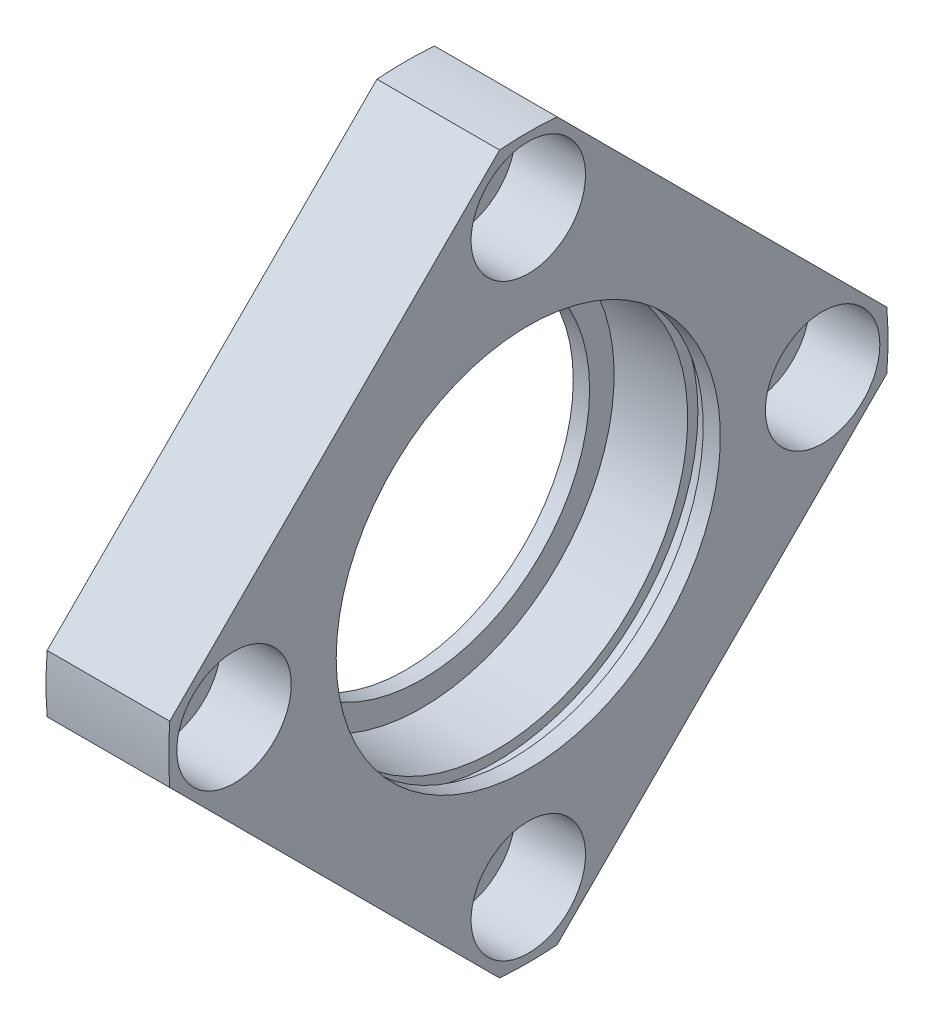
ISO-10303-21;
HEADER;
FILE_DESCRIPTION(('STEP AP214'),'2;1');
FILE_NAME('part.step','',(''),(''),'','','');
FILE_SCHEMA(('AUTOMOTIVE_DESIGN { 1 0 10303 214 1 1 1 1 }'));
ENDSEC;
DATA;
#1=APPLICATION_CONTEXT('core data for automotive mechanical design processes');
#2=APPLICATION_PROTOCOL_DEFINITION('international standard','automotive_design',2000,#1);
#3=PRODUCT_CONTEXT('',#1,'mechanical');
#4=PRODUCT('Part','Part','',(#3));
#5=PRODUCT_RELATED_PRODUCT_CATEGORY('part','',(#4));
#6=PRODUCT_DEFINITION_FORMATION('','',#4);
#7=PRODUCT_DEFINITION_CONTEXT('part definition',#1,'design');
#8=PRODUCT_DEFINITION('design','',#6,#7);
#9=PRODUCT_DEFINITION_SHAPE('','',#8);
#10=(LENGTH_UNIT() NAMED_UNIT(*) SI_UNIT(.MILLI.,.METRE.));
#11=(NAMED_UNIT(*) PLANE_ANGLE_UNIT() SI_UNIT($,.RADIAN.));
#12=(NAMED_UNIT(*) SI_UNIT($,.STERADIAN.) SOLID_ANGLE_UNIT());
#13=UNCERTAINTY_MEASURE_WITH_UNIT(LENGTH_MEASURE(1.E-05),#10,'distance_accuracy_value','');
#14=(GEOMETRIC_REPRESENTATION_CONTEXT(3) GLOBAL_UNCERTAINTY_ASSIGNED_CONTEXT((#13)) GLOBAL_UNIT_ASSIGNED_CONTEXT((#10,
#11,#12)) REPRESENTATION_CONTEXT('',''));
#15=CARTESIAN_POINT('',(0.,0.,0.));
#16=DIRECTION('',(0.,0.,1.));
#17=DIRECTION('',(1.,0.,0.));
#18=AXIS2_PLACEMENT_3D('',#15,#16,#17);
#19=CARTESIAN_POINT('',(15.,23.5,0.));
#20=DIRECTION('',(-1.,0.,0.));
#21=DIRECTION('',(0.,0.,1.));
#22=AXIS2_PLACEMENT_3D('',#19,#20,#21);
#23=PLANE('',#22);
#24=CARTESIAN_POINT('',(15.,36.,0.));
#25=DIRECTION('',(1.,0.,0.));
#26=DIRECTION('',(0.,0.,-1.));
#27=AXIS2_PLACEMENT_3D('',#24,#25,#26);
#28=CIRCLE('',#27,7.);
#29=CARTESIAN_POINT('',(15.,36.,-7.));
#30=VERTEX_POINT('',#29);
#31=EDGE_CURVE('E181',#30,#30,#28,.T.);
#32=ORIENTED_EDGE('',*,*,#31,.F.);
#33=EDGE_LOOP('',(#32));
#34=FACE_BOUND('',#33,.T.);
#35=CARTESIAN_POINT('',(15.,0.,-36.));
#36=DIRECTION('',(1.,0.,0.));
#37=DIRECTION('',(0.,0.,-1.));
#38=AXIS2_PLACEMENT_3D('',#35,#36,#37);
#39=CIRCLE('',#38,7.);
#40=CARTESIAN_POINT('',(15.,0.,-43.));
#41=VERTEX_POINT('',#40);
#42=EDGE_CURVE('E175',#41,#41,#39,.T.);
#43=ORIENTED_EDGE('',*,*,#42,.F.);
#44=EDGE_LOOP('',(#43));
#45=FACE_BOUND('',#44,.T.);
#46=CARTESIAN_POINT('',(15.,-36.,0.));
#47=DIRECTION('',(1.,0.,0.));
#48=DIRECTION('',(0.,0.,-1.));
#49=AXIS2_PLACEMENT_3D('',#46,#47,#48);
#50=CIRCLE('',#49,7.);
#51=CARTESIAN_POINT('',(15.,-36.,-7.));
#52=VERTEX_POINT('',#51);
#53=EDGE_CURVE('E169',#52,#52,#50,.T.);
#54=ORIENTED_EDGE('',*,*,#53,.F.);
#55=EDGE_LOOP('',(#54));
#56=FACE_BOUND('',#55,.T.);
#57=CARTESIAN_POINT('',(15.,0.,0.));
#58=DIRECTION('',(-1.,0.,0.));
#59=DIRECTION('',(0.,0.,1.));
#60=AXIS2_PLACEMENT_3D('',#57,#58,#59);
#61=CIRCLE('',#60,23.5);
#62=CARTESIAN_POINT('',(15.,0.,23.5));
#63=VERTEX_POINT('',#62);
#64=EDGE_CURVE('E157',#63,#63,#61,.T.);
#65=ORIENTED_EDGE('',*,*,#64,.T.);
#66=EDGE_LOOP('',(#65));
#67=FACE_BOUND('',#66,.T.);
#68=CARTESIAN_POINT('',(15.,0.,36.));
#69=DIRECTION('',(1.,0.,0.));
#70=DIRECTION('',(0.,0.,-1.));
#71=AXIS2_PLACEMENT_3D('',#68,#69,#70);
#72=CIRCLE('',#71,7.);
#73=CARTESIAN_POINT('',(15.,0.,29.));
#74=VERTEX_POINT('',#73);
#75=EDGE_CURVE('E163',#74,#74,#72,.T.);
#76=ORIENTED_EDGE('',*,*,#75,.F.);
#77=EDGE_LOOP('',(#76));
#78=FACE_BOUND('',#77,.T.);
#79=DIRECTION('',(0.,0.707106781186548,0.707106781186548));
#80=VECTOR('',#79,1.);
#81=CARTESIAN_POINT('',(15.,-3.51693441580504,43.8592199236936));
#82=LINE('',#81,#80);
#83=CARTESIAN_POINT('',(15.,-43.8592199236936,3.51693441580504));
#84=VERTEX_POINT('',#83);
#85=CARTESIAN_POINT('',(15.,-3.51693441580504,43.8592199236936));
#86=VERTEX_POINT('',#85);
#87=EDGE_CURVE('E101',#84,#86,#82,.T.);
#88=ORIENTED_EDGE('',*,*,#87,.F.);
#89=CARTESIAN_POINT('',(15.,0.,0.));
#90=DIRECTION('',(-1.,0.,0.));
#91=DIRECTION('',(0.,0.,1.));
#92=AXIS2_PLACEMENT_3D('',#89,#90,#91);
#93=CIRCLE('',#92,44.);
#94=CARTESIAN_POINT('',(15.,-43.8592199236936,-3.51693441580499));
#95=VERTEX_POINT('',#94);
#96=EDGE_CURVE('E113',#95,#84,#93,.T.);
#97=ORIENTED_EDGE('',*,*,#96,.F.);
#98=DIRECTION('',(0.,-0.707106781186547,0.707106781186547));
#99=VECTOR('',#98,1.);
#100=CARTESIAN_POINT('',(15.,-3.51693441580499,-43.8592199236936));
#101=LINE('',#100,#99);
#102=CARTESIAN_POINT('',(15.,-3.51693441580499,-43.8592199236936));
#103=VERTEX_POINT('',#102);
#104=EDGE_CURVE('E229',#103,#95,#101,.T.);
#105=ORIENTED_EDGE('',*,*,#104,.F.);
#106=CARTESIAN_POINT('',(15.,3.51693441580503,-43.8592199236936));
#107=VERTEX_POINT('',#106);
#108=EDGE_CURVE('E42',#107,#103,#93,.T.);
#109=ORIENTED_EDGE('',*,*,#108,.F.);
#110=DIRECTION('',(0.,-0.707106781186547,-0.707106781186548));
#111=VECTOR('',#110,1.);
#112=CARTESIAN_POINT('',(15.,43.8592199236936,-3.51693441580501));
#113=LINE('',#112,#111);
#114=CARTESIAN_POINT('',(15.,43.8592199236936,-3.51693441580501));
#115=VERTEX_POINT('',#114);
#116=EDGE_CURVE('E221',#115,#107,#113,.T.);
#117=ORIENTED_EDGE('',*,*,#116,.F.);
#118=CARTESIAN_POINT('',(15.,43.8592199236936,3.51693441580501));
#119=VERTEX_POINT('',#118);
#120=EDGE_CURVE('E11',#119,#115,#93,.T.);
#121=ORIENTED_EDGE('',*,*,#120,.F.);
#122=DIRECTION('',(0.,0.707106781186548,-0.707106781186548));
#123=VECTOR('',#122,1.);
#124=CARTESIAN_POINT('',(15.,43.8592199236936,3.51693441580501));
#125=LINE('',#124,#123);
#126=CARTESIAN_POINT('',(15.,3.51693441580502,43.8592199236936));
#127=VERTEX_POINT('',#126);
#128=EDGE_CURVE('E212',#127,#119,#125,.T.);
#129=ORIENTED_EDGE('',*,*,#128,.F.);
#130=EDGE_CURVE('E43',#86,#127,#93,.T.);
#131=ORIENTED_EDGE('',*,*,#130,.F.);
#132=EDGE_LOOP('',(#88,#97,#105,#109,#117,#121,#129,#131));
#133=FACE_BOUND('',#132,.T.);
#134=ADVANCED_FACE('F35',(#34,#45,#56,#67,#78,#133),#23,.F.);
#135=CARTESIAN_POINT('',(0.,0.,0.));
#136=DIRECTION('',(-1.,0.,0.));
#137=DIRECTION('',(0.,0.,1.));
#138=AXIS2_PLACEMENT_3D('',#135,#136,#137);
#139=CYLINDRICAL_SURFACE('',#138,44.);
#140=DIRECTION('',(-1.,0.,0.));
#141=VECTOR('',#140,1.);
#142=CARTESIAN_POINT('',(15.,-3.51693441580504,43.8592199236936));
#143=LINE('',#142,#141);
#144=CARTESIAN_POINT('',(0.,-3.51693441580504,43.8592199236937));
#145=VERTEX_POINT('',#144);
#146=EDGE_CURVE('E50',#86,#145,#143,.T.);
#147=ORIENTED_EDGE('',*,*,#146,.F.);
#148=ORIENTED_EDGE('',*,*,#130,.T.);
#149=DIRECTION('',(-1.,0.,0.));
#150=VECTOR('',#149,1.);
#151=CARTESIAN_POINT('',(15.,3.51693441580502,43.8592199236936));
#152=LINE('',#151,#150);
#153=CARTESIAN_POINT('',(0.,3.51693441580502,43.8592199236936));
#154=VERTEX_POINT('',#153);
#155=EDGE_CURVE('E208',#127,#154,#152,.T.);
#156=ORIENTED_EDGE('',*,*,#155,.T.);
#157=CARTESIAN_POINT('',(0.,0.,0.));
#158=DIRECTION('',(-1.,0.,0.));
#159=DIRECTION('',(0.,0.,1.));
#160=AXIS2_PLACEMENT_3D('',#157,#158,#159);
#161=CIRCLE('',#160,44.);
#162=EDGE_CURVE('E124',#145,#154,#161,.T.);
#163=ORIENTED_EDGE('',*,*,#162,.F.);
#164=EDGE_LOOP('',(#147,#148,#156,#163));
#165=FACE_BOUND('',#164,.T.);
#166=ADVANCED_FACE('F234',(#165),#139,.T.);
#167=DIRECTION('',(-1.,0.,0.));
#168=VECTOR('',#167,1.);
#169=CARTESIAN_POINT('',(15.,-43.8592199236936,3.51693441580504));
#170=LINE('',#169,#168);
#171=CARTESIAN_POINT('',(0.,-43.8592199236936,3.51693441580504));
#172=VERTEX_POINT('',#171);
#173=EDGE_CURVE('E98',#84,#172,#170,.T.);
#174=ORIENTED_EDGE('',*,*,#173,.T.);
#175=CARTESIAN_POINT('',(0.,-43.8592199236937,-3.51693441580499));
#176=VERTEX_POINT('',#175);
#177=EDGE_CURVE('E130',#176,#172,#161,.T.);
#178=ORIENTED_EDGE('',*,*,#177,.F.);
#179=DIRECTION('',(-1.,0.,0.));
#180=VECTOR('',#179,1.);
#181=CARTESIAN_POINT('',(15.,-43.8592199236936,-3.51693441580499));
#182=LINE('',#181,#180);
#183=EDGE_CURVE('E58',#95,#176,#182,.T.);
#184=ORIENTED_EDGE('',*,*,#183,.F.);
#185=ORIENTED_EDGE('',*,*,#96,.T.);
#186=EDGE_LOOP('',(#174,#178,#184,#185));
#187=FACE_BOUND('',#186,.T.);
#188=ADVANCED_FACE('F116',(#187),#139,.T.);
#189=CARTESIAN_POINT('',(0.,44.,0.));
#190=DIRECTION('',(1.,0.,0.));
#191=DIRECTION('',(0.,0.,-1.));
#192=AXIS2_PLACEMENT_3D('',#189,#190,#191);
#193=PLANE('',#192);
#194=CARTESIAN_POINT('',(0.,36.,0.));
#195=DIRECTION('',(1.,0.,0.));
#196=DIRECTION('',(0.,0.,-1.));
#197=AXIS2_PLACEMENT_3D('',#194,#195,#196);
#198=CIRCLE('',#197,4.25);
#199=CARTESIAN_POINT('',(0.,36.,-4.24999999999999));
#200=VERTEX_POINT('',#199);
#201=EDGE_CURVE('E202',#200,#200,#198,.T.);
#202=ORIENTED_EDGE('',*,*,#201,.T.);
#203=EDGE_LOOP('',(#202));
#204=FACE_BOUND('',#203,.T.);
#205=CARTESIAN_POINT('',(0.,0.,-36.));
#206=DIRECTION('',(1.,0.,0.));
#207=DIRECTION('',(0.,0.,-1.));
#208=AXIS2_PLACEMENT_3D('',#205,#206,#207);
#209=CIRCLE('',#208,4.25);
#210=CARTESIAN_POINT('',(0.,0.,-40.25));
#211=VERTEX_POINT('',#210);
#212=EDGE_CURVE('E196',#211,#211,#209,.T.);
#213=ORIENTED_EDGE('',*,*,#212,.T.);
#214=EDGE_LOOP('',(#213));
#215=FACE_BOUND('',#214,.T.);
#216=CARTESIAN_POINT('',(0.,-36.,0.));
#217=DIRECTION('',(1.,0.,0.));
#218=DIRECTION('',(0.,0.,-1.));
#219=AXIS2_PLACEMENT_3D('',#216,#217,#218);
#220=CIRCLE('',#219,4.25);
#221=CARTESIAN_POINT('',(0.,-36.,-4.25));
#222=VERTEX_POINT('',#221);
#223=EDGE_CURVE('E190',#222,#222,#220,.T.);
#224=ORIENTED_EDGE('',*,*,#223,.T.);
#225=EDGE_LOOP('',(#224));
#226=FACE_BOUND('',#225,.T.);
#227=CARTESIAN_POINT('',(0.,0.,36.));
#228=DIRECTION('',(1.,0.,0.));
#229=DIRECTION('',(0.,0.,-1.));
#230=AXIS2_PLACEMENT_3D('',#227,#228,#229);
#231=CIRCLE('',#230,4.25);
#232=CARTESIAN_POINT('',(0.,0.,31.75));
#233=VERTEX_POINT('',#232);
#234=EDGE_CURVE('E184',#233,#233,#231,.T.);
#235=ORIENTED_EDGE('',*,*,#234,.T.);
#236=EDGE_LOOP('',(#235));
#237=FACE_BOUND('',#236,.T.);
#238=CARTESIAN_POINT('',(0.,0.,0.));
#239=DIRECTION('',(-1.,0.,0.));
#240=DIRECTION('',(0.,0.,1.));
#241=AXIS2_PLACEMENT_3D('',#238,#239,#240);
#242=CIRCLE('',#241,20.5);
#243=CARTESIAN_POINT('',(0.,0.,20.5));
#244=VERTEX_POINT('',#243);
#245=EDGE_CURVE('E132',#244,#244,#242,.T.);
#246=ORIENTED_EDGE('',*,*,#245,.F.);
#247=EDGE_LOOP('',(#246));
#248=FACE_BOUND('',#247,.T.);
#249=DIRECTION('',(0.,0.707106781186548,0.707106781186548));
#250=VECTOR('',#249,1.);
#251=CARTESIAN_POINT('',(0.,-3.51693441580504,43.8592199236936));
#252=LINE('',#251,#250);
#253=EDGE_CURVE('E102',#172,#145,#252,.T.);
#254=ORIENTED_EDGE('',*,*,#253,.T.);
#255=ORIENTED_EDGE('',*,*,#162,.T.);
#256=DIRECTION('',(0.,0.707106781186548,-0.707106781186548));
#257=VECTOR('',#256,1.);
#258=CARTESIAN_POINT('',(0.,43.8592199236936,3.51693441580501));
#259=LINE('',#258,#257);
#260=CARTESIAN_POINT('',(0.,43.8592199236937,3.51693441580501));
#261=VERTEX_POINT('',#260);
#262=EDGE_CURVE('E213',#154,#261,#259,.T.);
#263=ORIENTED_EDGE('',*,*,#262,.T.);
#264=CARTESIAN_POINT('',(0.,43.8592199236936,-3.51693441580501));
#265=VERTEX_POINT('',#264);
#266=EDGE_CURVE('E118',#261,#265,#161,.T.);
#267=ORIENTED_EDGE('',*,*,#266,.T.);
#268=DIRECTION('',(0.,-0.707106781186547,-0.707106781186548));
#269=VECTOR('',#268,1.);
#270=CARTESIAN_POINT('',(0.,43.8592199236936,-3.51693441580501));
#271=LINE('',#270,#269);
#272=CARTESIAN_POINT('',(0.,3.51693441580501,-43.8592199236937));
#273=VERTEX_POINT('',#272);
#274=EDGE_CURVE('E222',#265,#273,#271,.T.);
#275=ORIENTED_EDGE('',*,*,#274,.T.);
#276=CARTESIAN_POINT('',(0.,-3.51693441580499,-43.8592199236936));
#277=VERTEX_POINT('',#276);
#278=EDGE_CURVE('E123',#273,#277,#161,.T.);
#279=ORIENTED_EDGE('',*,*,#278,.T.);
#280=DIRECTION('',(0.,-0.707106781186547,0.707106781186547));
#281=VECTOR('',#280,1.);
#282=CARTESIAN_POINT('',(0.,-3.51693441580499,-43.8592199236936));
#283=LINE('',#282,#281);
#284=EDGE_CURVE('E107',#277,#176,#283,.T.);
#285=ORIENTED_EDGE('',*,*,#284,.T.);
#286=ORIENTED_EDGE('',*,*,#177,.T.);
#287=EDGE_LOOP('',(#254,#255,#263,#267,#275,#279,#285,#286));
#288=FACE_BOUND('',#287,.T.);
#289=ADVANCED_FACE('F233',(#204,#215,#226,#237,#248,#288),#193,.F.);
#290=DIRECTION('',(-1.,0.,0.));
#291=VECTOR('',#290,1.);
#292=CARTESIAN_POINT('',(15.,-3.51693441580499,-43.8592199236936));
#293=LINE('',#292,#291);
#294=EDGE_CURVE('E224',#103,#277,#293,.T.);
#295=ORIENTED_EDGE('',*,*,#294,.T.);
#296=ORIENTED_EDGE('',*,*,#278,.F.);
#297=DIRECTION('',(-1.,0.,0.));
#298=VECTOR('',#297,1.);
#299=CARTESIAN_POINT('',(15.,3.51693441580503,-43.8592199236936));
#300=LINE('',#299,#298);
#301=EDGE_CURVE('E219',#107,#273,#300,.T.);
#302=ORIENTED_EDGE('',*,*,#301,.F.);
#303=ORIENTED_EDGE('',*,*,#108,.T.);
#304=EDGE_LOOP('',(#295,#296,#302,#303));
#305=FACE_BOUND('',#304,.T.);
#306=ADVANCED_FACE('F248',(#305),#139,.T.);
#307=DIRECTION('',(-1.,0.,0.));
#308=VECTOR('',#307,1.);
#309=CARTESIAN_POINT('',(15.,43.8592199236936,-3.51693441580501));
#310=LINE('',#309,#308);
#311=EDGE_CURVE('E215',#115,#265,#310,.T.);
#312=ORIENTED_EDGE('',*,*,#311,.T.);
#313=ORIENTED_EDGE('',*,*,#266,.F.);
#314=DIRECTION('',(-1.,0.,0.));
#315=VECTOR('',#314,1.);
#316=CARTESIAN_POINT('',(15.,43.8592199236936,3.51693441580501));
#317=LINE('',#316,#315);
#318=EDGE_CURVE('E210',#119,#261,#317,.T.);
#319=ORIENTED_EDGE('',*,*,#318,.F.);
#320=ORIENTED_EDGE('',*,*,#120,.T.);
#321=EDGE_LOOP('',(#312,#313,#319,#320));
#322=FACE_BOUND('',#321,.T.);
#323=ADVANCED_FACE('F242',(#322),#139,.T.);
#324=CARTESIAN_POINT('',(0.,0.,0.));
#325=DIRECTION('',(-1.,0.,0.));
#326=DIRECTION('',(0.,0.,1.));
#327=AXIS2_PLACEMENT_3D('',#324,#325,#326);
#328=CYLINDRICAL_SURFACE('',#327,20.5);
#329=CARTESIAN_POINT('',(2.,0.,0.));
#330=DIRECTION('',(-1.,0.,0.));
#331=DIRECTION('',(0.,0.,1.));
#332=AXIS2_PLACEMENT_3D('',#329,#330,#331);
#333=CIRCLE('',#332,20.5);
#334=CARTESIAN_POINT('',(2.,0.,20.5));
#335=VERTEX_POINT('',#334);
#336=EDGE_CURVE('E136',#335,#335,#333,.T.);
#337=ORIENTED_EDGE('',*,*,#336,.F.);
#338=EDGE_LOOP('',(#337));
#339=FACE_BOUND('',#338,.T.);
#340=ORIENTED_EDGE('',*,*,#245,.T.);
#341=EDGE_LOOP('',(#340));
#342=FACE_BOUND('',#341,.T.);
#343=ADVANCED_FACE('F314',(#339,#342),#328,.F.);
#344=CARTESIAN_POINT('',(2.,20.5,0.));
#345=DIRECTION('',(-1.,0.,0.));
#346=DIRECTION('',(0.,0.,1.));
#347=AXIS2_PLACEMENT_3D('',#344,#345,#346);
#348=PLANE('',#347);
#349=CARTESIAN_POINT('',(2.,0.,0.));
#350=DIRECTION('',(-1.,0.,0.));
#351=DIRECTION('',(0.,0.,1.));
#352=AXIS2_PLACEMENT_3D('',#349,#350,#351);
#353=CIRCLE('',#352,23.5);
#354=CARTESIAN_POINT('',(2.,0.,23.5));
#355=VERTEX_POINT('',#354);
#356=EDGE_CURVE('E140',#355,#355,#353,.T.);
#357=ORIENTED_EDGE('',*,*,#356,.F.);
#358=EDGE_LOOP('',(#357));
#359=FACE_BOUND('',#358,.T.);
#360=ORIENTED_EDGE('',*,*,#336,.T.);
#361=EDGE_LOOP('',(#360));
#362=FACE_BOUND('',#361,.T.);
#363=ADVANCED_FACE('F310',(#359,#362),#348,.F.);
#364=CARTESIAN_POINT('',(0.,0.,0.));
#365=DIRECTION('',(-1.,0.,0.));
#366=DIRECTION('',(0.,0.,1.));
#367=AXIS2_PLACEMENT_3D('',#364,#365,#366);
#368=CYLINDRICAL_SURFACE('',#367,23.5);
#369=CARTESIAN_POINT('',(11.,0.,0.));
#370=DIRECTION('',(-1.,0.,0.));
#371=DIRECTION('',(0.,0.,1.));
#372=AXIS2_PLACEMENT_3D('',#369,#370,#371);
#373=CIRCLE('',#372,23.5);
#374=CARTESIAN_POINT('',(11.,0.,23.5));
#375=VERTEX_POINT('',#374);
#376=EDGE_CURVE('E145',#375,#375,#373,.T.);
#377=ORIENTED_EDGE('',*,*,#376,.F.);
#378=EDGE_LOOP('',(#377));
#379=FACE_BOUND('',#378,.T.);
#380=ORIENTED_EDGE('',*,*,#356,.T.);
#381=EDGE_LOOP('',(#380));
#382=FACE_BOUND('',#381,.T.);
#383=ADVANCED_FACE('F306',(#379,#382),#368,.F.);
#384=CARTESIAN_POINT('',(11.,23.5,0.));
#385=DIRECTION('',(-1.,0.,0.));
#386=DIRECTION('',(0.,0.,1.));
#387=AXIS2_PLACEMENT_3D('',#384,#385,#386);
#388=PLANE('',#387);
#389=CARTESIAN_POINT('',(11.,0.,0.));
#390=DIRECTION('',(-1.,0.,0.));
#391=DIRECTION('',(0.,0.,1.));
#392=AXIS2_PLACEMENT_3D('',#389,#390,#391);
#393=CIRCLE('',#392,24.75);
#394=CARTESIAN_POINT('',(11.,0.,24.75));
#395=VERTEX_POINT('',#394);
#396=EDGE_CURVE('E148',#395,#395,#393,.T.);
#397=ORIENTED_EDGE('',*,*,#396,.F.);
#398=EDGE_LOOP('',(#397));
#399=FACE_BOUND('',#398,.T.);
#400=ORIENTED_EDGE('',*,*,#376,.T.);
#401=EDGE_LOOP('',(#400));
#402=FACE_BOUND('',#401,.T.);
#403=ADVANCED_FACE('F302',(#399,#402),#388,.F.);
#404=CARTESIAN_POINT('',(0.,0.,0.));
#405=DIRECTION('',(-1.,0.,0.));
#406=DIRECTION('',(0.,0.,1.));
#407=AXIS2_PLACEMENT_3D('',#404,#405,#406);
#408=CYLINDRICAL_SURFACE('',#407,24.75);
#409=CARTESIAN_POINT('',(12.9,0.,0.));
#410=DIRECTION('',(-1.,0.,0.));
#411=DIRECTION('',(0.,0.,1.));
#412=AXIS2_PLACEMENT_3D('',#409,#410,#411);
#413=CIRCLE('',#412,24.75);
#414=CARTESIAN_POINT('',(12.9,0.,24.75));
#415=VERTEX_POINT('',#414);
#416=EDGE_CURVE('E151',#415,#415,#413,.T.);
#417=ORIENTED_EDGE('',*,*,#416,.F.);
#418=EDGE_LOOP('',(#417));
#419=FACE_BOUND('',#418,.T.);
#420=ORIENTED_EDGE('',*,*,#396,.T.);
#421=EDGE_LOOP('',(#420));
#422=FACE_BOUND('',#421,.T.);
#423=ADVANCED_FACE('F298',(#419,#422),#408,.F.);
#424=CARTESIAN_POINT('',(12.9,24.75,0.));
#425=DIRECTION('',(1.,0.,0.));
#426=DIRECTION('',(0.,0.,-1.));
#427=AXIS2_PLACEMENT_3D('',#424,#425,#426);
#428=PLANE('',#427);
#429=CARTESIAN_POINT('',(12.9,0.,0.));
#430=DIRECTION('',(-1.,0.,0.));
#431=DIRECTION('',(0.,0.,1.));
#432=AXIS2_PLACEMENT_3D('',#429,#430,#431);
#433=CIRCLE('',#432,23.5);
#434=CARTESIAN_POINT('',(12.9,0.,23.5));
#435=VERTEX_POINT('',#434);
#436=EDGE_CURVE('E154',#435,#435,#433,.T.);
#437=ORIENTED_EDGE('',*,*,#436,.F.);
#438=EDGE_LOOP('',(#437));
#439=FACE_BOUND('',#438,.T.);
#440=ORIENTED_EDGE('',*,*,#416,.T.);
#441=EDGE_LOOP('',(#440));
#442=FACE_BOUND('',#441,.T.);
#443=ADVANCED_FACE('F294',(#439,#442),#428,.F.);
#444=CARTESIAN_POINT('',(0.,0.,0.));
#445=DIRECTION('',(-1.,0.,0.));
#446=DIRECTION('',(0.,0.,1.));
#447=AXIS2_PLACEMENT_3D('',#444,#445,#446);
#448=CYLINDRICAL_SURFACE('',#447,23.5);
#449=ORIENTED_EDGE('',*,*,#64,.F.);
#450=EDGE_LOOP('',(#449));
#451=FACE_BOUND('',#450,.T.);
#452=ORIENTED_EDGE('',*,*,#436,.T.);
#453=EDGE_LOOP('',(#452));
#454=FACE_BOUND('',#453,.T.);
#455=ADVANCED_FACE('F286',(#451,#454),#448,.F.);
#456=CARTESIAN_POINT('',(6.4,0.,36.));
#457=DIRECTION('',(-1.,0.,0.));
#458=DIRECTION('',(0.,0.,1.));
#459=AXIS2_PLACEMENT_3D('',#456,#457,#458);
#460=PLANE('',#459);
#461=CARTESIAN_POINT('',(6.4,0.,36.));
#462=DIRECTION('',(1.,0.,0.));
#463=DIRECTION('',(0.,0.,-1.));
#464=AXIS2_PLACEMENT_3D('',#461,#462,#463);
#465=CIRCLE('',#464,4.25);
#466=CARTESIAN_POINT('',(6.4,0.,31.75));
#467=VERTEX_POINT('',#466);
#468=EDGE_CURVE('E187',#467,#467,#465,.T.);
#469=ORIENTED_EDGE('',*,*,#468,.F.);
#470=EDGE_LOOP('',(#469));
#471=FACE_BOUND('',#470,.T.);
#472=CARTESIAN_POINT('',(6.4,0.,36.));
#473=DIRECTION('',(1.,0.,0.));
#474=DIRECTION('',(0.,0.,-1.));
#475=AXIS2_PLACEMENT_3D('',#472,#473,#474);
#476=CIRCLE('',#475,7.);
#477=CARTESIAN_POINT('',(6.4,0.,29.));
#478=VERTEX_POINT('',#477);
#479=EDGE_CURVE('E160',#478,#478,#476,.T.);
#480=ORIENTED_EDGE('',*,*,#479,.T.);
#481=EDGE_LOOP('',(#480));
#482=FACE_BOUND('',#481,.T.);
#483=ADVANCED_FACE('F276',(#471,#482),#460,.F.);
#484=CARTESIAN_POINT('',(15.,0.,36.));
#485=DIRECTION('',(1.,0.,0.));
#486=DIRECTION('',(0.,0.,-1.));
#487=AXIS2_PLACEMENT_3D('',#484,#485,#486);
#488=CYLINDRICAL_SURFACE('',#487,7.);
#489=ORIENTED_EDGE('',*,*,#479,.F.);
#490=EDGE_LOOP('',(#489));
#491=FACE_BOUND('',#490,.T.);
#492=ORIENTED_EDGE('',*,*,#75,.T.);
#493=EDGE_LOOP('',(#492));
#494=FACE_BOUND('',#493,.T.);
#495=ADVANCED_FACE('F273',(#491,#494),#488,.F.);
#496=CARTESIAN_POINT('',(6.40000000000001,-36.,0.));
#497=DIRECTION('',(-1.,0.,0.));
#498=DIRECTION('',(0.,0.,1.));
#499=AXIS2_PLACEMENT_3D('',#496,#497,#498);
#500=PLANE('',#499);
#501=CARTESIAN_POINT('',(6.4,-36.,0.));
#502=DIRECTION('',(1.,0.,0.));
#503=DIRECTION('',(0.,0.,-1.));
#504=AXIS2_PLACEMENT_3D('',#501,#502,#503);
#505=CIRCLE('',#504,4.25);
#506=CARTESIAN_POINT('',(6.4,-36.,-4.25));
#507=VERTEX_POINT('',#506);
#508=EDGE_CURVE('E193',#507,#507,#505,.T.);
#509=ORIENTED_EDGE('',*,*,#508,.F.);
#510=EDGE_LOOP('',(#509));
#511=FACE_BOUND('',#510,.T.);
#512=CARTESIAN_POINT('',(6.40000000000001,-36.,0.));
#513=DIRECTION('',(1.,0.,0.));
#514=DIRECTION('',(0.,0.,-1.));
#515=AXIS2_PLACEMENT_3D('',#512,#513,#514);
#516=CIRCLE('',#515,7.);
#517=CARTESIAN_POINT('',(6.40000000000001,-36.,-7.));
#518=VERTEX_POINT('',#517);
#519=EDGE_CURVE('E166',#518,#518,#516,.T.);
#520=ORIENTED_EDGE('',*,*,#519,.T.);
#521=EDGE_LOOP('',(#520));
#522=FACE_BOUND('',#521,.T.);
#523=ADVANCED_FACE('F275',(#511,#522),#500,.F.);
#524=CARTESIAN_POINT('',(15.,-36.,0.));
#525=DIRECTION('',(1.,0.,0.));
#526=DIRECTION('',(0.,0.,-1.));
#527=AXIS2_PLACEMENT_3D('',#524,#525,#526);
#528=CYLINDRICAL_SURFACE('',#527,7.);
#529=ORIENTED_EDGE('',*,*,#519,.F.);
#530=EDGE_LOOP('',(#529));
#531=FACE_BOUND('',#530,.T.);
#532=ORIENTED_EDGE('',*,*,#53,.T.);
#533=EDGE_LOOP('',(#532));
#534=FACE_BOUND('',#533,.T.);
#535=ADVANCED_FACE('F283',(#531,#534),#528,.F.);
#536=CARTESIAN_POINT('',(6.4,0.,-36.));
#537=DIRECTION('',(-1.,0.,0.));
#538=DIRECTION('',(0.,0.,1.));
#539=AXIS2_PLACEMENT_3D('',#536,#537,#538);
#540=PLANE('',#539);
#541=CARTESIAN_POINT('',(6.4,0.,-36.));
#542=DIRECTION('',(1.,0.,0.));
#543=DIRECTION('',(0.,0.,-1.));
#544=AXIS2_PLACEMENT_3D('',#541,#542,#543);
#545=CIRCLE('',#544,4.25);
#546=CARTESIAN_POINT('',(6.4,0.,-40.25));
#547=VERTEX_POINT('',#546);
#548=EDGE_CURVE('E199',#547,#547,#545,.T.);
#549=ORIENTED_EDGE('',*,*,#548,.F.);
#550=EDGE_LOOP('',(#549));
#551=FACE_BOUND('',#550,.T.);
#552=CARTESIAN_POINT('',(6.4,0.,-36.));
#553=DIRECTION('',(1.,0.,0.));
#554=DIRECTION('',(0.,0.,-1.));
#555=AXIS2_PLACEMENT_3D('',#552,#553,#554);
#556=CIRCLE('',#555,7.);
#557=CARTESIAN_POINT('',(6.4,0.,-43.));
#558=VERTEX_POINT('',#557);
#559=EDGE_CURVE('E172',#558,#558,#556,.T.);
#560=ORIENTED_EDGE('',*,*,#559,.T.);
#561=EDGE_LOOP('',(#560));
#562=FACE_BOUND('',#561,.T.);
#563=ADVANCED_FACE('F360',(#551,#562),#540,.F.);
#564=CARTESIAN_POINT('',(15.,0.,-36.));
#565=DIRECTION('',(1.,0.,0.));
#566=DIRECTION('',(0.,0.,-1.));
#567=AXIS2_PLACEMENT_3D('',#564,#565,#566);
#568=CYLINDRICAL_SURFACE('',#567,7.);
#569=ORIENTED_EDGE('',*,*,#559,.F.);
#570=EDGE_LOOP('',(#569));
#571=FACE_BOUND('',#570,.T.);
#572=ORIENTED_EDGE('',*,*,#42,.T.);
#573=EDGE_LOOP('',(#572));
#574=FACE_BOUND('',#573,.T.);
#575=ADVANCED_FACE('F356',(#571,#574),#568,.F.);
#576=CARTESIAN_POINT('',(6.4,36.,0.));
#577=DIRECTION('',(-1.,0.,0.));
#578=DIRECTION('',(0.,0.,1.));
#579=AXIS2_PLACEMENT_3D('',#576,#577,#578);
#580=PLANE('',#579);
#581=CARTESIAN_POINT('',(6.4,36.,0.));
#582=DIRECTION('',(1.,0.,0.));
#583=DIRECTION('',(0.,0.,-1.));
#584=AXIS2_PLACEMENT_3D('',#581,#582,#583);
#585=CIRCLE('',#584,4.25);
#586=CARTESIAN_POINT('',(6.4,36.,-4.24999999999999));
#587=VERTEX_POINT('',#586);
#588=EDGE_CURVE('E205',#587,#587,#585,.T.);
#589=ORIENTED_EDGE('',*,*,#588,.F.);
#590=EDGE_LOOP('',(#589));
#591=FACE_BOUND('',#590,.T.);
#592=CARTESIAN_POINT('',(6.4,36.,0.));
#593=DIRECTION('',(1.,0.,0.));
#594=DIRECTION('',(0.,0.,-1.));
#595=AXIS2_PLACEMENT_3D('',#592,#593,#594);
#596=CIRCLE('',#595,7.);
#597=CARTESIAN_POINT('',(6.4,36.,-6.99999999999999));
#598=VERTEX_POINT('',#597);
#599=EDGE_CURVE('E178',#598,#598,#596,.T.);
#600=ORIENTED_EDGE('',*,*,#599,.T.);
#601=EDGE_LOOP('',(#600));
#602=FACE_BOUND('',#601,.T.);
#603=ADVANCED_FACE('F349',(#591,#602),#580,.F.);
#604=CARTESIAN_POINT('',(15.,36.,0.));
#605=DIRECTION('',(1.,0.,0.));
#606=DIRECTION('',(0.,0.,-1.));
#607=AXIS2_PLACEMENT_3D('',#604,#605,#606);
#608=CYLINDRICAL_SURFACE('',#607,7.);
#609=ORIENTED_EDGE('',*,*,#599,.F.);
#610=EDGE_LOOP('',(#609));
#611=FACE_BOUND('',#610,.T.);
#612=ORIENTED_EDGE('',*,*,#31,.T.);
#613=EDGE_LOOP('',(#612));
#614=FACE_BOUND('',#613,.T.);
#615=ADVANCED_FACE('F338',(#611,#614),#608,.F.);
#616=CARTESIAN_POINT('',(6.4,0.,36.));
#617=DIRECTION('',(1.,0.,0.));
#618=DIRECTION('',(0.,0.,-1.));
#619=AXIS2_PLACEMENT_3D('',#616,#617,#618);
#620=CYLINDRICAL_SURFACE('',#619,4.25);
#621=ORIENTED_EDGE('',*,*,#234,.F.);
#622=EDGE_LOOP('',(#621));
#623=FACE_BOUND('',#622,.T.);
#624=ORIENTED_EDGE('',*,*,#468,.T.);
#625=EDGE_LOOP('',(#624));
#626=FACE_BOUND('',#625,.T.);
#627=ADVANCED_FACE('F334',(#623,#626),#620,.F.);
#628=CARTESIAN_POINT('',(6.4,-36.,0.));
#629=DIRECTION('',(1.,0.,0.));
#630=DIRECTION('',(0.,0.,-1.));
#631=AXIS2_PLACEMENT_3D('',#628,#629,#630);
#632=CYLINDRICAL_SURFACE('',#631,4.25);
#633=ORIENTED_EDGE('',*,*,#223,.F.);
#634=EDGE_LOOP('',(#633));
#635=FACE_BOUND('',#634,.T.);
#636=ORIENTED_EDGE('',*,*,#508,.T.);
#637=EDGE_LOOP('',(#636));
#638=FACE_BOUND('',#637,.T.);
#639=ADVANCED_FACE('F337',(#635,#638),#632,.F.);
#640=CARTESIAN_POINT('',(6.4,0.,-36.));
#641=DIRECTION('',(1.,0.,0.));
#642=DIRECTION('',(0.,0.,-1.));
#643=AXIS2_PLACEMENT_3D('',#640,#641,#642);
#644=CYLINDRICAL_SURFACE('',#643,4.25);
#645=ORIENTED_EDGE('',*,*,#212,.F.);
#646=EDGE_LOOP('',(#645));
#647=FACE_BOUND('',#646,.T.);
#648=ORIENTED_EDGE('',*,*,#548,.T.);
#649=EDGE_LOOP('',(#648));
#650=FACE_BOUND('',#649,.T.);
#651=ADVANCED_FACE('F346',(#647,#650),#644,.F.);
#652=CARTESIAN_POINT('',(6.4,36.,0.));
#653=DIRECTION('',(1.,0.,0.));
#654=DIRECTION('',(0.,0.,-1.));
#655=AXIS2_PLACEMENT_3D('',#652,#653,#654);
#656=CYLINDRICAL_SURFACE('',#655,4.25);
#657=ORIENTED_EDGE('',*,*,#201,.F.);
#658=EDGE_LOOP('',(#657));
#659=FACE_BOUND('',#658,.T.);
#660=ORIENTED_EDGE('',*,*,#588,.T.);
#661=EDGE_LOOP('',(#660));
#662=FACE_BOUND('',#661,.T.);
#663=ADVANCED_FACE('F493',(#659,#662),#656,.F.);
#664=CARTESIAN_POINT('',(15.,43.8592199236936,3.51693441580501));
#665=DIRECTION('',(0.,0.707106781186547,0.707106781186547));
#666=DIRECTION('',(0.,-0.707106781186548,0.707106781186548));
#667=AXIS2_PLACEMENT_3D('',#664,#665,#666);
#668=PLANE('',#667);
#669=ORIENTED_EDGE('',*,*,#262,.F.);
#670=ORIENTED_EDGE('',*,*,#155,.F.);
#671=ORIENTED_EDGE('',*,*,#128,.T.);
#672=ORIENTED_EDGE('',*,*,#318,.T.);
#673=EDGE_LOOP('',(#669,#670,#671,#672));
#674=FACE_BOUND('',#673,.T.);
#675=ADVANCED_FACE('F236',(#674),#668,.T.);
#676=CARTESIAN_POINT('',(15.,43.8592199236936,-3.51693441580501));
#677=DIRECTION('',(0.,0.707106781186548,-0.707106781186547));
#678=DIRECTION('',(0.,0.707106781186547,0.707106781186548));
#679=AXIS2_PLACEMENT_3D('',#676,#677,#678);
#680=PLANE('',#679);
#681=ORIENTED_EDGE('',*,*,#274,.F.);
#682=ORIENTED_EDGE('',*,*,#311,.F.);
#683=ORIENTED_EDGE('',*,*,#116,.T.);
#684=ORIENTED_EDGE('',*,*,#301,.T.);
#685=EDGE_LOOP('',(#681,#682,#683,#684));
#686=FACE_BOUND('',#685,.T.);
#687=ADVANCED_FACE('F244',(#686),#680,.T.);
#688=CARTESIAN_POINT('',(15.,-3.51693441580499,-43.8592199236936));
#689=DIRECTION('',(0.,-0.707106781186548,-0.707106781186548));
#690=DIRECTION('',(0.,0.707106781186548,-0.707106781186548));
#691=AXIS2_PLACEMENT_3D('',#688,#689,#690);
#692=PLANE('',#691);
#693=ORIENTED_EDGE('',*,*,#284,.F.);
#694=ORIENTED_EDGE('',*,*,#294,.F.);
#695=ORIENTED_EDGE('',*,*,#104,.T.);
#696=ORIENTED_EDGE('',*,*,#183,.T.);
#697=EDGE_LOOP('',(#693,#694,#695,#696));
#698=FACE_BOUND('',#697,.T.);
#699=ADVANCED_FACE('F249',(#698),#692,.T.);
#700=CARTESIAN_POINT('',(15.,-3.51693441580504,43.8592199236936));
#701=DIRECTION('',(0.,-0.707106781186547,0.707106781186547));
#702=DIRECTION('',(0.,-0.707106781186548,-0.707106781186548));
#703=AXIS2_PLACEMENT_3D('',#700,#701,#702);
#704=PLANE('',#703);
#705=ORIENTED_EDGE('',*,*,#253,.F.);
#706=ORIENTED_EDGE('',*,*,#173,.F.);
#707=ORIENTED_EDGE('',*,*,#87,.T.);
#708=ORIENTED_EDGE('',*,*,#146,.T.);
#709=EDGE_LOOP('',(#705,#706,#707,#708));
#710=FACE_BOUND('',#709,.T.);
#711=ADVANCED_FACE('F100',(#710),#704,.T.);
#712=CLOSED_SHELL('',(#134,#166,#188,#289,#306,#323,#343,#363,#383,#403,#423,#443,#455,#483,
#495,#523,#535,#563,#575,#603,#615,#627,#639,#651,#663,#675,#687,#699,#711));
#713=MANIFOLD_SOLID_BREP('B2',#712);
#714=ADVANCED_BREP_SHAPE_REPRESENTATION('',(#18,#713),#14);
#715=SHAPE_DEFINITION_REPRESENTATION(#9,#714);
ENDSEC;
END-ISO-10303-21;
